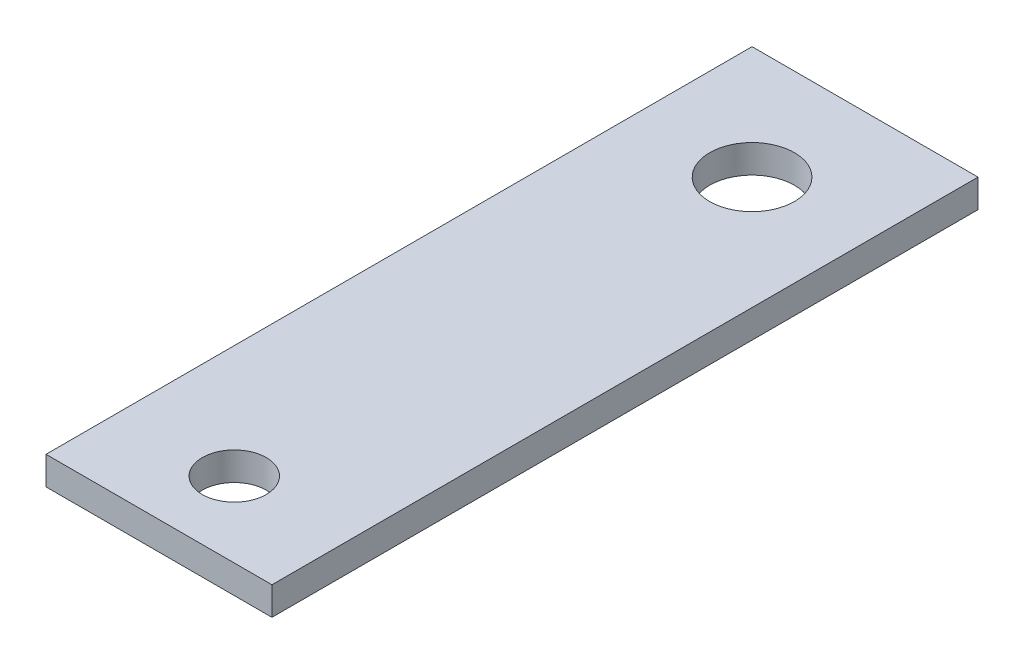
ISO-10303-21;
HEADER;
FILE_DESCRIPTION(('STEP AP214'),'2;1');
FILE_NAME('part.step','',(''),(''),'','','');
FILE_SCHEMA(('AUTOMOTIVE_DESIGN { 1 0 10303 214 1 1 1 1 }'));
ENDSEC;
DATA;
#1=APPLICATION_CONTEXT('core data for automotive mechanical design processes');
#2=APPLICATION_PROTOCOL_DEFINITION('international standard','automotive_design',2000,#1);
#3=PRODUCT_CONTEXT('',#1,'mechanical');
#4=PRODUCT('Part','Part','',(#3));
#5=PRODUCT_RELATED_PRODUCT_CATEGORY('part','',(#4));
#6=PRODUCT_DEFINITION_FORMATION('','',#4);
#7=PRODUCT_DEFINITION_CONTEXT('part definition',#1,'design');
#8=PRODUCT_DEFINITION('design','',#6,#7);
#9=PRODUCT_DEFINITION_SHAPE('','',#8);
#10=(LENGTH_UNIT() NAMED_UNIT(*) SI_UNIT(.MILLI.,.METRE.));
#11=(NAMED_UNIT(*) PLANE_ANGLE_UNIT() SI_UNIT($,.RADIAN.));
#12=(NAMED_UNIT(*) SI_UNIT($,.STERADIAN.) SOLID_ANGLE_UNIT());
#13=UNCERTAINTY_MEASURE_WITH_UNIT(LENGTH_MEASURE(1.E-05),#10,'distance_accuracy_value','');
#14=(GEOMETRIC_REPRESENTATION_CONTEXT(3) GLOBAL_UNCERTAINTY_ASSIGNED_CONTEXT((#13)) GLOBAL_UNIT_ASSIGNED_CONTEXT((#10,
#11,#12)) REPRESENTATION_CONTEXT('',''));
#15=CARTESIAN_POINT('',(0.,0.,0.));
#16=DIRECTION('',(0.,0.,1.));
#17=DIRECTION('',(1.,0.,0.));
#18=AXIS2_PLACEMENT_3D('',#15,#16,#17);
#19=CARTESIAN_POINT('',(40.,100.75,39.));
#20=DIRECTION('',(0.,0.,1.));
#21=DIRECTION('',(1.,0.,0.));
#22=AXIS2_PLACEMENT_3D('',#19,#20,#21);
#23=PLANE('',#22);
#24=DIRECTION('',(-1.,0.,0.));
#25=VECTOR('',#24,1.);
#26=CARTESIAN_POINT('',(40.,100.,39.));
#27=LINE('',#26,#25);
#28=CARTESIAN_POINT('',(46.,100.,39.));
#29=VERTEX_POINT('',#28);
#30=CARTESIAN_POINT('',(34.,100.,39.));
#31=VERTEX_POINT('',#30);
#32=EDGE_CURVE('E10',#29,#31,#27,.T.);
#33=ORIENTED_EDGE('',*,*,#32,.F.);
#34=DIRECTION('',(0.,-1.,0.));
#35=VECTOR('',#34,1.);
#36=CARTESIAN_POINT('',(46.,100.75,39.));
#37=LINE('',#36,#35);
#38=CARTESIAN_POINT('',(46.,101.5,39.));
#39=VERTEX_POINT('',#38);
#40=EDGE_CURVE('E62',#39,#29,#37,.T.);
#41=ORIENTED_EDGE('',*,*,#40,.F.);
#42=DIRECTION('',(1.,0.,0.));
#43=VECTOR('',#42,1.);
#44=CARTESIAN_POINT('',(40.,101.5,39.));
#45=LINE('',#44,#43);
#46=CARTESIAN_POINT('',(34.,101.5,39.));
#47=VERTEX_POINT('',#46);
#48=EDGE_CURVE('E90',#47,#39,#45,.T.);
#49=ORIENTED_EDGE('',*,*,#48,.F.);
#50=DIRECTION('',(0.,1.,0.));
#51=VECTOR('',#50,1.);
#52=CARTESIAN_POINT('',(34.,100.75,39.));
#53=LINE('',#52,#51);
#54=EDGE_CURVE('E24',#31,#47,#53,.T.);
#55=ORIENTED_EDGE('',*,*,#54,.F.);
#56=EDGE_LOOP('',(#33,#41,#49,#55));
#57=FACE_BOUND('',#56,.T.);
#58=ADVANCED_FACE('F16',(#57),#23,.T.);
#59=CARTESIAN_POINT('',(40.,100.,1.5));
#60=DIRECTION('',(0.,-1.,0.));
#61=DIRECTION('',(0.,0.,-1.));
#62=AXIS2_PLACEMENT_3D('',#59,#60,#61);
#63=PLANE('',#62);
#64=CARTESIAN_POINT('',(40.,100.,35.));
#65=DIRECTION('',(0.,-1.,0.));
#66=DIRECTION('',(0.,0.,-1.));
#67=AXIS2_PLACEMENT_3D('',#64,#65,#66);
#68=CIRCLE('',#67,1.7);
#69=CARTESIAN_POINT('',(40.,100.,33.3));
#70=VERTEX_POINT('',#69);
#71=EDGE_CURVE('E94',#70,#70,#68,.T.);
#72=ORIENTED_EDGE('',*,*,#71,.F.);
#73=EDGE_LOOP('',(#72));
#74=FACE_BOUND('',#73,.T.);
#75=CARTESIAN_POINT('',(40.,100.,7.5));
#76=DIRECTION('',(0.,-1.,0.));
#77=DIRECTION('',(0.,0.,-1.));
#78=AXIS2_PLACEMENT_3D('',#75,#76,#77);
#79=CIRCLE('',#78,2.25);
#80=CARTESIAN_POINT('',(40.,100.,5.25));
#81=VERTEX_POINT('',#80);
#82=EDGE_CURVE('E73',#81,#81,#79,.T.);
#83=ORIENTED_EDGE('',*,*,#82,.F.);
#84=EDGE_LOOP('',(#83));
#85=FACE_BOUND('',#84,.T.);
#86=DIRECTION('',(0.,0.,1.));
#87=VECTOR('',#86,1.);
#88=CARTESIAN_POINT('',(46.,100.,1.5));
#89=LINE('',#88,#87);
#90=CARTESIAN_POINT('',(46.,100.,1.5));
#91=VERTEX_POINT('',#90);
#92=EDGE_CURVE('E55',#91,#29,#89,.T.);
#93=ORIENTED_EDGE('',*,*,#92,.T.);
#94=ORIENTED_EDGE('',*,*,#32,.T.);
#95=DIRECTION('',(0.,0.,1.));
#96=VECTOR('',#95,1.);
#97=CARTESIAN_POINT('',(34.,100.,1.5));
#98=LINE('',#97,#96);
#99=CARTESIAN_POINT('',(34.,100.,1.5));
#100=VERTEX_POINT('',#99);
#101=EDGE_CURVE('E68',#100,#31,#98,.T.);
#102=ORIENTED_EDGE('',*,*,#101,.F.);
#103=DIRECTION('',(1.,0.,0.));
#104=VECTOR('',#103,1.);
#105=CARTESIAN_POINT('',(40.,100.,1.5));
#106=LINE('',#105,#104);
#107=EDGE_CURVE('E66',#100,#91,#106,.T.);
#108=ORIENTED_EDGE('',*,*,#107,.T.);
#109=EDGE_LOOP('',(#93,#94,#102,#108));
#110=FACE_BOUND('',#109,.T.);
#111=ADVANCED_FACE('F67',(#74,#85,#110),#63,.T.);
#112=CARTESIAN_POINT('',(34.,100.75,1.5));
#113=DIRECTION('',(-1.,0.,0.));
#114=DIRECTION('',(0.,0.,1.));
#115=AXIS2_PLACEMENT_3D('',#112,#113,#114);
#116=PLANE('',#115);
#117=ORIENTED_EDGE('',*,*,#101,.T.);
#118=ORIENTED_EDGE('',*,*,#54,.T.);
#119=DIRECTION('',(0.,0.,1.));
#120=VECTOR('',#119,1.);
#121=CARTESIAN_POINT('',(34.,101.5,1.5));
#122=LINE('',#121,#120);
#123=CARTESIAN_POINT('',(34.,101.5,1.5));
#124=VERTEX_POINT('',#123);
#125=EDGE_CURVE('E85',#124,#47,#122,.T.);
#126=ORIENTED_EDGE('',*,*,#125,.F.);
#127=DIRECTION('',(0.,-1.,0.));
#128=VECTOR('',#127,1.);
#129=CARTESIAN_POINT('',(34.,100.75,1.5));
#130=LINE('',#129,#128);
#131=EDGE_CURVE('E72',#124,#100,#130,.T.);
#132=ORIENTED_EDGE('',*,*,#131,.T.);
#133=EDGE_LOOP('',(#117,#118,#126,#132));
#134=FACE_BOUND('',#133,.T.);
#135=ADVANCED_FACE('F110',(#134),#116,.T.);
#136=CARTESIAN_POINT('',(40.,101.5,1.5));
#137=DIRECTION('',(0.,1.,0.));
#138=DIRECTION('',(0.,0.,1.));
#139=AXIS2_PLACEMENT_3D('',#136,#137,#138);
#140=PLANE('',#139);
#141=CARTESIAN_POINT('',(40.,101.5,35.));
#142=DIRECTION('',(0.,1.,0.));
#143=DIRECTION('',(0.,0.,1.));
#144=AXIS2_PLACEMENT_3D('',#141,#142,#143);
#145=CIRCLE('',#144,1.7);
#146=CARTESIAN_POINT('',(40.,101.5,36.7));
#147=VERTEX_POINT('',#146);
#148=EDGE_CURVE('E19',#147,#147,#145,.T.);
#149=ORIENTED_EDGE('',*,*,#148,.F.);
#150=EDGE_LOOP('',(#149));
#151=FACE_BOUND('',#150,.T.);
#152=CARTESIAN_POINT('',(40.,101.5,7.5));
#153=DIRECTION('',(0.,1.,0.));
#154=DIRECTION('',(0.,0.,1.));
#155=AXIS2_PLACEMENT_3D('',#152,#153,#154);
#156=CIRCLE('',#155,2.25);
#157=CARTESIAN_POINT('',(40.,101.5,9.75));
#158=VERTEX_POINT('',#157);
#159=EDGE_CURVE('E92',#158,#158,#156,.T.);
#160=ORIENTED_EDGE('',*,*,#159,.F.);
#161=EDGE_LOOP('',(#160));
#162=FACE_BOUND('',#161,.T.);
#163=ORIENTED_EDGE('',*,*,#125,.T.);
#164=ORIENTED_EDGE('',*,*,#48,.T.);
#165=DIRECTION('',(0.,0.,1.));
#166=VECTOR('',#165,1.);
#167=CARTESIAN_POINT('',(46.,101.5,1.5));
#168=LINE('',#167,#166);
#169=CARTESIAN_POINT('',(46.,101.5,1.5));
#170=VERTEX_POINT('',#169);
#171=EDGE_CURVE('E63',#170,#39,#168,.T.);
#172=ORIENTED_EDGE('',*,*,#171,.F.);
#173=DIRECTION('',(-1.,0.,0.));
#174=VECTOR('',#173,1.);
#175=CARTESIAN_POINT('',(40.,101.5,1.5));
#176=LINE('',#175,#174);
#177=EDGE_CURVE('E78',#170,#124,#176,.T.);
#178=ORIENTED_EDGE('',*,*,#177,.T.);
#179=EDGE_LOOP('',(#163,#164,#172,#178));
#180=FACE_BOUND('',#179,.T.);
#181=ADVANCED_FACE('F107',(#151,#162,#180),#140,.T.);
#182=CARTESIAN_POINT('',(40.,100.75,1.5));
#183=DIRECTION('',(0.,0.,-1.));
#184=DIRECTION('',(-1.,0.,0.));
#185=AXIS2_PLACEMENT_3D('',#182,#183,#184);
#186=PLANE('',#185);
#187=DIRECTION('',(0.,1.,0.));
#188=VECTOR('',#187,1.);
#189=CARTESIAN_POINT('',(46.,100.75,1.5));
#190=LINE('',#189,#188);
#191=EDGE_CURVE('E60',#91,#170,#190,.T.);
#192=ORIENTED_EDGE('',*,*,#191,.F.);
#193=ORIENTED_EDGE('',*,*,#107,.F.);
#194=ORIENTED_EDGE('',*,*,#131,.F.);
#195=ORIENTED_EDGE('',*,*,#177,.F.);
#196=EDGE_LOOP('',(#192,#193,#194,#195));
#197=FACE_BOUND('',#196,.T.);
#198=ADVANCED_FACE('F76',(#197),#186,.T.);
#199=CARTESIAN_POINT('',(46.,100.75,1.5));
#200=DIRECTION('',(1.,0.,0.));
#201=DIRECTION('',(0.,0.,-1.));
#202=AXIS2_PLACEMENT_3D('',#199,#200,#201);
#203=PLANE('',#202);
#204=ORIENTED_EDGE('',*,*,#191,.T.);
#205=ORIENTED_EDGE('',*,*,#171,.T.);
#206=ORIENTED_EDGE('',*,*,#40,.T.);
#207=ORIENTED_EDGE('',*,*,#92,.F.);
#208=EDGE_LOOP('',(#204,#205,#206,#207));
#209=FACE_BOUND('',#208,.T.);
#210=ADVANCED_FACE('F57',(#209),#203,.T.);
#211=CARTESIAN_POINT('',(40.,99.,7.5));
#212=DIRECTION('',(0.,1.,0.));
#213=DIRECTION('',(0.,0.,1.));
#214=AXIS2_PLACEMENT_3D('',#211,#212,#213);
#215=CYLINDRICAL_SURFACE('',#214,2.25);
#216=ORIENTED_EDGE('',*,*,#82,.T.);
#217=EDGE_LOOP('',(#216));
#218=FACE_BOUND('',#217,.T.);
#219=ORIENTED_EDGE('',*,*,#159,.T.);
#220=EDGE_LOOP('',(#219));
#221=FACE_BOUND('',#220,.T.);
#222=ADVANCED_FACE('F163',(#218,#221),#215,.F.);
#223=CARTESIAN_POINT('',(40.,99.,35.));
#224=DIRECTION('',(0.,1.,0.));
#225=DIRECTION('',(0.,0.,1.));
#226=AXIS2_PLACEMENT_3D('',#223,#224,#225);
#227=CYLINDRICAL_SURFACE('',#226,1.7);
#228=ORIENTED_EDGE('',*,*,#71,.T.);
#229=EDGE_LOOP('',(#228));
#230=FACE_BOUND('',#229,.T.);
#231=ORIENTED_EDGE('',*,*,#148,.T.);
#232=EDGE_LOOP('',(#231));
#233=FACE_BOUND('',#232,.T.);
#234=ADVANCED_FACE('F105',(#230,#233),#227,.F.);
#235=CLOSED_SHELL('',(#58,#111,#135,#181,#198,#210,#222,#234));
#236=MANIFOLD_SOLID_BREP('B1',#235);
#237=ADVANCED_BREP_SHAPE_REPRESENTATION('',(#18,#236),#14);
#238=SHAPE_DEFINITION_REPRESENTATION(#9,#237);
ENDSEC;
END-ISO-10303-21;
